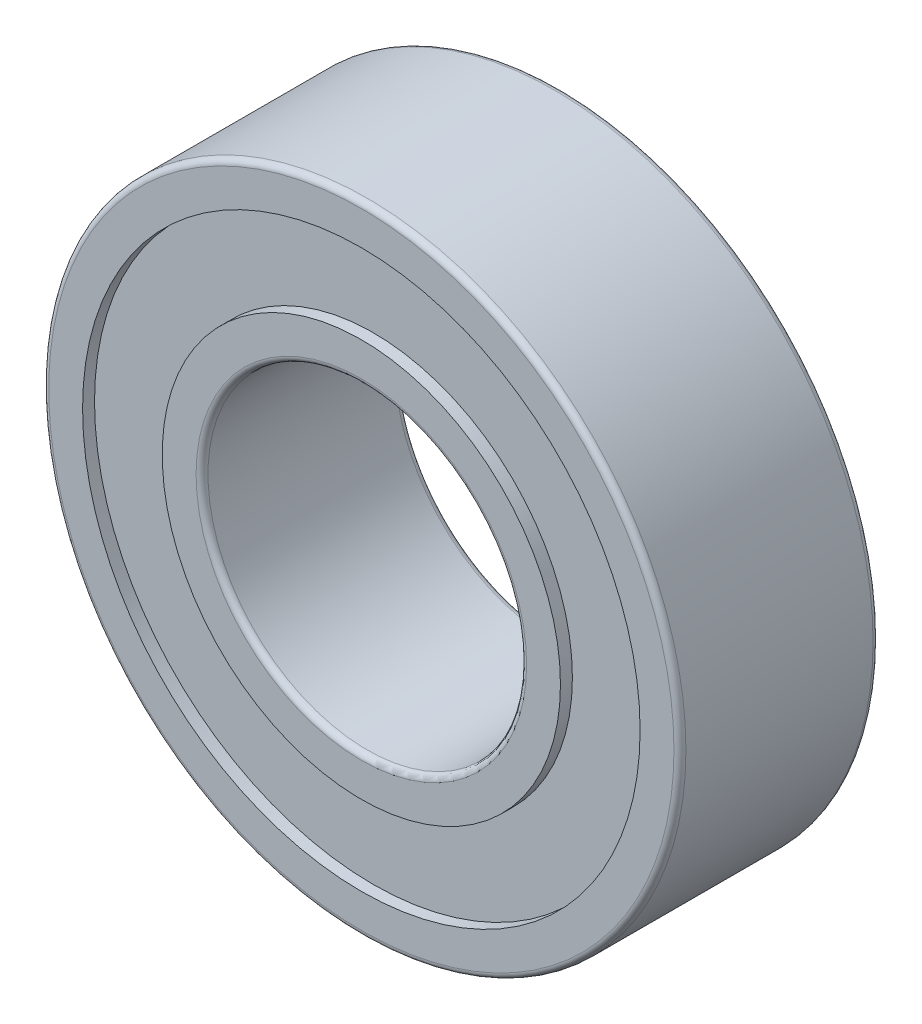
ISO-10303-21;
HEADER;
FILE_DESCRIPTION(('STEP AP214'),'2;1');
FILE_NAME('part.step','',(''),(''),'','','');
FILE_SCHEMA(('AUTOMOTIVE_DESIGN { 1 0 10303 214 1 1 1 1 }'));
ENDSEC;
DATA;
#1=APPLICATION_CONTEXT('core data for automotive mechanical design processes');
#2=APPLICATION_PROTOCOL_DEFINITION('international standard','automotive_design',2000,#1);
#3=PRODUCT_CONTEXT('',#1,'mechanical');
#4=PRODUCT('Part','Part','',(#3));
#5=PRODUCT_RELATED_PRODUCT_CATEGORY('part','',(#4));
#6=PRODUCT_DEFINITION_FORMATION('','',#4);
#7=PRODUCT_DEFINITION_CONTEXT('part definition',#1,'design');
#8=PRODUCT_DEFINITION('design','',#6,#7);
#9=PRODUCT_DEFINITION_SHAPE('','',#8);
#10=(LENGTH_UNIT() NAMED_UNIT(*) SI_UNIT(.MILLI.,.METRE.));
#11=(NAMED_UNIT(*) PLANE_ANGLE_UNIT() SI_UNIT($,.RADIAN.));
#12=(NAMED_UNIT(*) SI_UNIT($,.STERADIAN.) SOLID_ANGLE_UNIT());
#13=UNCERTAINTY_MEASURE_WITH_UNIT(LENGTH_MEASURE(1.E-05),#10,'distance_accuracy_value','');
#14=(GEOMETRIC_REPRESENTATION_CONTEXT(3) GLOBAL_UNCERTAINTY_ASSIGNED_CONTEXT((#13)) GLOBAL_UNIT_ASSIGNED_CONTEXT((#10,
#11,#12)) REPRESENTATION_CONTEXT('',''));
#15=CARTESIAN_POINT('',(0.,0.,0.));
#16=DIRECTION('',(0.,0.,1.));
#17=DIRECTION('',(1.,0.,0.));
#18=AXIS2_PLACEMENT_3D('',#15,#16,#17);
#19=CARTESIAN_POINT('',(0.,0.,0.));
#20=DIRECTION('',(0.,0.,1.));
#21=DIRECTION('',(1.,0.,0.));
#22=AXIS2_PLACEMENT_3D('',#19,#20,#21);
#23=PLANE('',#22);
#24=CARTESIAN_POINT('',(0.,0.,0.));
#25=DIRECTION('',(0.,0.,1.));
#26=DIRECTION('',(1.,0.,0.));
#27=AXIS2_PLACEMENT_3D('',#24,#25,#26);
#28=CIRCLE('',#27,4.15);
#29=CARTESIAN_POINT('',(4.15,0.,0.));
#30=VERTEX_POINT('',#29);
#31=EDGE_CURVE('E62',#30,#30,#28,.T.);
#32=ORIENTED_EDGE('',*,*,#31,.T.);
#33=EDGE_LOOP('',(#32));
#34=FACE_BOUND('',#33,.T.);
#35=CARTESIAN_POINT('',(0.,0.,0.));
#36=DIRECTION('',(0.,0.,1.));
#37=DIRECTION('',(1.,0.,0.));
#38=AXIS2_PLACEMENT_3D('',#35,#36,#37);
#39=CIRCLE('',#38,5.);
#40=CARTESIAN_POINT('',(5.,0.,0.));
#41=VERTEX_POINT('',#40);
#42=EDGE_CURVE('E84',#41,#41,#39,.T.);
#43=ORIENTED_EDGE('',*,*,#42,.F.);
#44=EDGE_LOOP('',(#43));
#45=FACE_BOUND('',#44,.T.);
#46=ADVANCED_FACE('F33',(#34,#45),#23,.F.);
#47=CARTESIAN_POINT('',(0.,0.,5.));
#48=DIRECTION('',(0.,0.,1.));
#49=DIRECTION('',(1.,0.,0.));
#50=AXIS2_PLACEMENT_3D('',#47,#48,#49);
#51=PLANE('',#50);
#52=CARTESIAN_POINT('',(0.,0.,5.));
#53=DIRECTION('',(0.,0.,1.));
#54=DIRECTION('',(1.,0.,0.));
#55=AXIS2_PLACEMENT_3D('',#52,#53,#54);
#56=CIRCLE('',#55,4.15);
#57=CARTESIAN_POINT('',(4.15,0.,5.));
#58=VERTEX_POINT('',#57);
#59=EDGE_CURVE('E40',#58,#58,#56,.F.);
#60=ORIENTED_EDGE('',*,*,#59,.T.);
#61=EDGE_LOOP('',(#60));
#62=FACE_BOUND('',#61,.T.);
#63=CARTESIAN_POINT('',(0.,0.,5.));
#64=DIRECTION('',(0.,0.,1.));
#65=DIRECTION('',(1.,0.,0.));
#66=AXIS2_PLACEMENT_3D('',#63,#64,#65);
#67=CIRCLE('',#66,5.);
#68=CARTESIAN_POINT('',(5.,0.,5.));
#69=VERTEX_POINT('',#68);
#70=EDGE_CURVE('E72',#69,#69,#67,.T.);
#71=ORIENTED_EDGE('',*,*,#70,.T.);
#72=EDGE_LOOP('',(#71));
#73=FACE_BOUND('',#72,.T.);
#74=ADVANCED_FACE('F101',(#62,#73),#51,.T.);
#75=CARTESIAN_POINT('',(0.,0.,5.));
#76=DIRECTION('',(0.,0.,1.));
#77=DIRECTION('',(1.,0.,0.));
#78=AXIS2_PLACEMENT_3D('',#75,#76,#77);
#79=CIRCLE('',#78,7.85);
#80=CARTESIAN_POINT('',(7.85,0.,5.));
#81=VERTEX_POINT('',#80);
#82=EDGE_CURVE('E10',#81,#81,#79,.T.);
#83=ORIENTED_EDGE('',*,*,#82,.T.);
#84=EDGE_LOOP('',(#83));
#85=FACE_BOUND('',#84,.T.);
#86=CARTESIAN_POINT('',(0.,0.,5.));
#87=DIRECTION('',(0.,0.,1.));
#88=DIRECTION('',(1.,0.,0.));
#89=AXIS2_PLACEMENT_3D('',#86,#87,#88);
#90=CIRCLE('',#89,7.);
#91=CARTESIAN_POINT('',(7.,0.,5.));
#92=VERTEX_POINT('',#91);
#93=EDGE_CURVE('E66',#92,#92,#90,.T.);
#94=ORIENTED_EDGE('',*,*,#93,.F.);
#95=EDGE_LOOP('',(#94));
#96=FACE_BOUND('',#95,.T.);
#97=ADVANCED_FACE('F108',(#85,#96),#51,.T.);
#98=CARTESIAN_POINT('',(0.,0.,0.));
#99=DIRECTION('',(0.,0.,1.));
#100=DIRECTION('',(1.,0.,0.));
#101=AXIS2_PLACEMENT_3D('',#98,#99,#100);
#102=CIRCLE('',#101,7.85);
#103=CARTESIAN_POINT('',(7.85,0.,0.));
#104=VERTEX_POINT('',#103);
#105=EDGE_CURVE('E44',#104,#104,#102,.F.);
#106=ORIENTED_EDGE('',*,*,#105,.T.);
#107=EDGE_LOOP('',(#106));
#108=FACE_BOUND('',#107,.T.);
#109=CARTESIAN_POINT('',(0.,0.,0.));
#110=DIRECTION('',(0.,0.,1.));
#111=DIRECTION('',(1.,0.,0.));
#112=AXIS2_PLACEMENT_3D('',#109,#110,#111);
#113=CIRCLE('',#112,7.);
#114=CARTESIAN_POINT('',(7.,0.,0.));
#115=VERTEX_POINT('',#114);
#116=EDGE_CURVE('E78',#115,#115,#113,.T.);
#117=ORIENTED_EDGE('',*,*,#116,.T.);
#118=EDGE_LOOP('',(#117));
#119=FACE_BOUND('',#118,.T.);
#120=ADVANCED_FACE('F104',(#108,#119),#23,.F.);
#121=CARTESIAN_POINT('',(0.,0.,5.));
#122=DIRECTION('',(0.,0.,-1.));
#123=DIRECTION('',(-1.,0.,0.));
#124=AXIS2_PLACEMENT_3D('',#121,#122,#123);
#125=CYLINDRICAL_SURFACE('',#124,8.);
#126=CARTESIAN_POINT('',(0.,0.,0.15));
#127=DIRECTION('',(0.,0.,1.));
#128=DIRECTION('',(1.,0.,0.));
#129=AXIS2_PLACEMENT_3D('',#126,#127,#128);
#130=CIRCLE('',#129,8.);
#131=CARTESIAN_POINT('',(8.,0.,0.15));
#132=VERTEX_POINT('',#131);
#133=EDGE_CURVE('E48',#132,#132,#130,.T.);
#134=ORIENTED_EDGE('',*,*,#133,.T.);
#135=EDGE_LOOP('',(#134));
#136=FACE_BOUND('',#135,.T.);
#137=CARTESIAN_POINT('',(0.,0.,4.85));
#138=DIRECTION('',(0.,0.,1.));
#139=DIRECTION('',(1.,0.,0.));
#140=AXIS2_PLACEMENT_3D('',#137,#138,#139);
#141=CIRCLE('',#140,8.);
#142=CARTESIAN_POINT('',(8.,0.,4.85));
#143=VERTEX_POINT('',#142);
#144=EDGE_CURVE('E53',#143,#143,#141,.F.);
#145=ORIENTED_EDGE('',*,*,#144,.T.);
#146=EDGE_LOOP('',(#145));
#147=FACE_BOUND('',#146,.T.);
#148=ADVANCED_FACE('F112',(#136,#147),#125,.T.);
#149=CARTESIAN_POINT('',(0.,0.,5.));
#150=DIRECTION('',(0.,0.,-1.));
#151=DIRECTION('',(-1.,0.,0.));
#152=AXIS2_PLACEMENT_3D('',#149,#150,#151);
#153=CYLINDRICAL_SURFACE('',#152,4.);
#154=CARTESIAN_POINT('',(0.,0.,0.15));
#155=DIRECTION('',(0.,0.,1.));
#156=DIRECTION('',(1.,0.,0.));
#157=AXIS2_PLACEMENT_3D('',#154,#155,#156);
#158=CIRCLE('',#157,4.);
#159=CARTESIAN_POINT('',(4.,0.,0.15));
#160=VERTEX_POINT('',#159);
#161=EDGE_CURVE('E56',#160,#160,#158,.F.);
#162=ORIENTED_EDGE('',*,*,#161,.T.);
#163=EDGE_LOOP('',(#162));
#164=FACE_BOUND('',#163,.T.);
#165=CARTESIAN_POINT('',(0.,0.,4.85));
#166=DIRECTION('',(0.,0.,1.));
#167=DIRECTION('',(1.,0.,0.));
#168=AXIS2_PLACEMENT_3D('',#165,#166,#167);
#169=CIRCLE('',#168,4.);
#170=CARTESIAN_POINT('',(4.,0.,4.85));
#171=VERTEX_POINT('',#170);
#172=EDGE_CURVE('E59',#171,#171,#169,.T.);
#173=ORIENTED_EDGE('',*,*,#172,.T.);
#174=EDGE_LOOP('',(#173));
#175=FACE_BOUND('',#174,.T.);
#176=ADVANCED_FACE('F118',(#164,#175),#153,.F.);
#177=CARTESIAN_POINT('',(0.,0.,4.7));
#178=DIRECTION('',(0.,0.,1.));
#179=DIRECTION('',(1.,0.,0.));
#180=AXIS2_PLACEMENT_3D('',#177,#178,#179);
#181=CYLINDRICAL_SURFACE('',#180,7.);
#182=CARTESIAN_POINT('',(0.,0.,4.7));
#183=DIRECTION('',(0.,0.,1.));
#184=DIRECTION('',(1.,0.,0.));
#185=AXIS2_PLACEMENT_3D('',#182,#183,#184);
#186=CIRCLE('',#185,7.);
#187=CARTESIAN_POINT('',(7.,0.,4.7));
#188=VERTEX_POINT('',#187);
#189=EDGE_CURVE('E65',#188,#188,#186,.T.);
#190=ORIENTED_EDGE('',*,*,#189,.F.);
#191=EDGE_LOOP('',(#190));
#192=FACE_BOUND('',#191,.T.);
#193=ORIENTED_EDGE('',*,*,#93,.T.);
#194=EDGE_LOOP('',(#193));
#195=FACE_BOUND('',#194,.T.);
#196=ADVANCED_FACE('F140',(#192,#195),#181,.F.);
#197=CARTESIAN_POINT('',(0.,0.,4.7));
#198=DIRECTION('',(0.,0.,1.));
#199=DIRECTION('',(1.,0.,0.));
#200=AXIS2_PLACEMENT_3D('',#197,#198,#199);
#201=PLANE('',#200);
#202=CARTESIAN_POINT('',(0.,0.,4.7));
#203=DIRECTION('',(0.,0.,1.));
#204=DIRECTION('',(1.,0.,0.));
#205=AXIS2_PLACEMENT_3D('',#202,#203,#204);
#206=CIRCLE('',#205,5.);
#207=CARTESIAN_POINT('',(5.,0.,4.7));
#208=VERTEX_POINT('',#207);
#209=EDGE_CURVE('E69',#208,#208,#206,.T.);
#210=ORIENTED_EDGE('',*,*,#209,.F.);
#211=EDGE_LOOP('',(#210));
#212=FACE_BOUND('',#211,.T.);
#213=ORIENTED_EDGE('',*,*,#189,.T.);
#214=EDGE_LOOP('',(#213));
#215=FACE_BOUND('',#214,.T.);
#216=ADVANCED_FACE('F136',(#212,#215),#201,.T.);
#217=CARTESIAN_POINT('',(0.,0.,4.7));
#218=DIRECTION('',(0.,0.,1.));
#219=DIRECTION('',(1.,0.,0.));
#220=AXIS2_PLACEMENT_3D('',#217,#218,#219);
#221=CYLINDRICAL_SURFACE('',#220,5.);
#222=ORIENTED_EDGE('',*,*,#209,.T.);
#223=EDGE_LOOP('',(#222));
#224=FACE_BOUND('',#223,.T.);
#225=ORIENTED_EDGE('',*,*,#70,.F.);
#226=EDGE_LOOP('',(#225));
#227=FACE_BOUND('',#226,.T.);
#228=ADVANCED_FACE('F130',(#224,#227),#221,.T.);
#229=CARTESIAN_POINT('',(0.,0.,0.5));
#230=DIRECTION('',(0.,0.,1.));
#231=DIRECTION('',(1.,0.,0.));
#232=AXIS2_PLACEMENT_3D('',#229,#230,#231);
#233=PLANE('',#232);
#234=CARTESIAN_POINT('',(0.,0.,0.5));
#235=DIRECTION('',(0.,0.,1.));
#236=DIRECTION('',(1.,0.,0.));
#237=AXIS2_PLACEMENT_3D('',#234,#235,#236);
#238=CIRCLE('',#237,7.);
#239=CARTESIAN_POINT('',(7.,0.,0.5));
#240=VERTEX_POINT('',#239);
#241=EDGE_CURVE('E75',#240,#240,#238,.T.);
#242=ORIENTED_EDGE('',*,*,#241,.F.);
#243=EDGE_LOOP('',(#242));
#244=FACE_BOUND('',#243,.T.);
#245=CARTESIAN_POINT('',(0.,0.,0.5));
#246=DIRECTION('',(0.,0.,1.));
#247=DIRECTION('',(1.,0.,0.));
#248=AXIS2_PLACEMENT_3D('',#245,#246,#247);
#249=CIRCLE('',#248,5.);
#250=CARTESIAN_POINT('',(5.,0.,0.5));
#251=VERTEX_POINT('',#250);
#252=EDGE_CURVE('E81',#251,#251,#249,.T.);
#253=ORIENTED_EDGE('',*,*,#252,.T.);
#254=EDGE_LOOP('',(#253));
#255=FACE_BOUND('',#254,.T.);
#256=ADVANCED_FACE('F90',(#244,#255),#233,.F.);
#257=CARTESIAN_POINT('',(0.,0.,0.5));
#258=DIRECTION('',(0.,0.,-1.));
#259=DIRECTION('',(-1.,0.,0.));
#260=AXIS2_PLACEMENT_3D('',#257,#258,#259);
#261=CYLINDRICAL_SURFACE('',#260,7.);
#262=ORIENTED_EDGE('',*,*,#241,.T.);
#263=EDGE_LOOP('',(#262));
#264=FACE_BOUND('',#263,.T.);
#265=ORIENTED_EDGE('',*,*,#116,.F.);
#266=EDGE_LOOP('',(#265));
#267=FACE_BOUND('',#266,.T.);
#268=ADVANCED_FACE('F96',(#264,#267),#261,.F.);
#269=CARTESIAN_POINT('',(0.,0.,0.5));
#270=DIRECTION('',(0.,0.,-1.));
#271=DIRECTION('',(-1.,0.,0.));
#272=AXIS2_PLACEMENT_3D('',#269,#270,#271);
#273=CYLINDRICAL_SURFACE('',#272,5.);
#274=ORIENTED_EDGE('',*,*,#252,.F.);
#275=EDGE_LOOP('',(#274));
#276=FACE_BOUND('',#275,.T.);
#277=ORIENTED_EDGE('',*,*,#42,.T.);
#278=EDGE_LOOP('',(#277));
#279=FACE_BOUND('',#278,.T.);
#280=ADVANCED_FACE('F92',(#276,#279),#273,.T.);
#281=CARTESIAN_POINT('',(0.,0.,0.15));
#282=DIRECTION('',(0.,0.,1.));
#283=DIRECTION('',(1.,0.,0.));
#284=AXIS2_PLACEMENT_3D('',#281,#282,#283);
#285=TOROIDAL_SURFACE('',#284,4.15,0.15);
#286=ORIENTED_EDGE('',*,*,#161,.F.);
#287=EDGE_LOOP('',(#286));
#288=FACE_BOUND('',#287,.T.);
#289=ORIENTED_EDGE('',*,*,#31,.F.);
#290=EDGE_LOOP('',(#289));
#291=FACE_BOUND('',#290,.T.);
#292=ADVANCED_FACE('F95',(#288,#291),#285,.T.);
#293=CARTESIAN_POINT('',(0.,0.,0.15));
#294=DIRECTION('',(0.,0.,1.));
#295=DIRECTION('',(1.,0.,0.));
#296=AXIS2_PLACEMENT_3D('',#293,#294,#295);
#297=TOROIDAL_SURFACE('',#296,7.85,0.15);
#298=ORIENTED_EDGE('',*,*,#105,.F.);
#299=EDGE_LOOP('',(#298));
#300=FACE_BOUND('',#299,.T.);
#301=ORIENTED_EDGE('',*,*,#133,.F.);
#302=EDGE_LOOP('',(#301));
#303=FACE_BOUND('',#302,.T.);
#304=ADVANCED_FACE('F155',(#300,#303),#297,.T.);
#305=CARTESIAN_POINT('',(0.,0.,4.85));
#306=DIRECTION('',(0.,0.,1.));
#307=DIRECTION('',(1.,0.,0.));
#308=AXIS2_PLACEMENT_3D('',#305,#306,#307);
#309=TOROIDAL_SURFACE('',#308,4.15,0.15);
#310=ORIENTED_EDGE('',*,*,#59,.F.);
#311=EDGE_LOOP('',(#310));
#312=FACE_BOUND('',#311,.T.);
#313=ORIENTED_EDGE('',*,*,#172,.F.);
#314=EDGE_LOOP('',(#313));
#315=FACE_BOUND('',#314,.T.);
#316=ADVANCED_FACE('F153',(#312,#315),#309,.T.);
#317=CARTESIAN_POINT('',(0.,0.,4.85));
#318=DIRECTION('',(0.,0.,1.));
#319=DIRECTION('',(1.,0.,0.));
#320=AXIS2_PLACEMENT_3D('',#317,#318,#319);
#321=TOROIDAL_SURFACE('',#320,7.85,0.15);
#322=ORIENTED_EDGE('',*,*,#144,.F.);
#323=EDGE_LOOP('',(#322));
#324=FACE_BOUND('',#323,.T.);
#325=ORIENTED_EDGE('',*,*,#82,.F.);
#326=EDGE_LOOP('',(#325));
#327=FACE_BOUND('',#326,.T.);
#328=ADVANCED_FACE('F35',(#324,#327),#321,.T.);
#329=CLOSED_SHELL('',(#46,#74,#97,#120,#148,#176,#196,#216,#228,#256,#268,#280,#292,#304,#316,#328));
#330=MANIFOLD_SOLID_BREP('B2',#329);
#331=ADVANCED_BREP_SHAPE_REPRESENTATION('',(#18,#330),#14);
#332=SHAPE_DEFINITION_REPRESENTATION(#9,#331);
ENDSEC;
END-ISO-10303-21;
